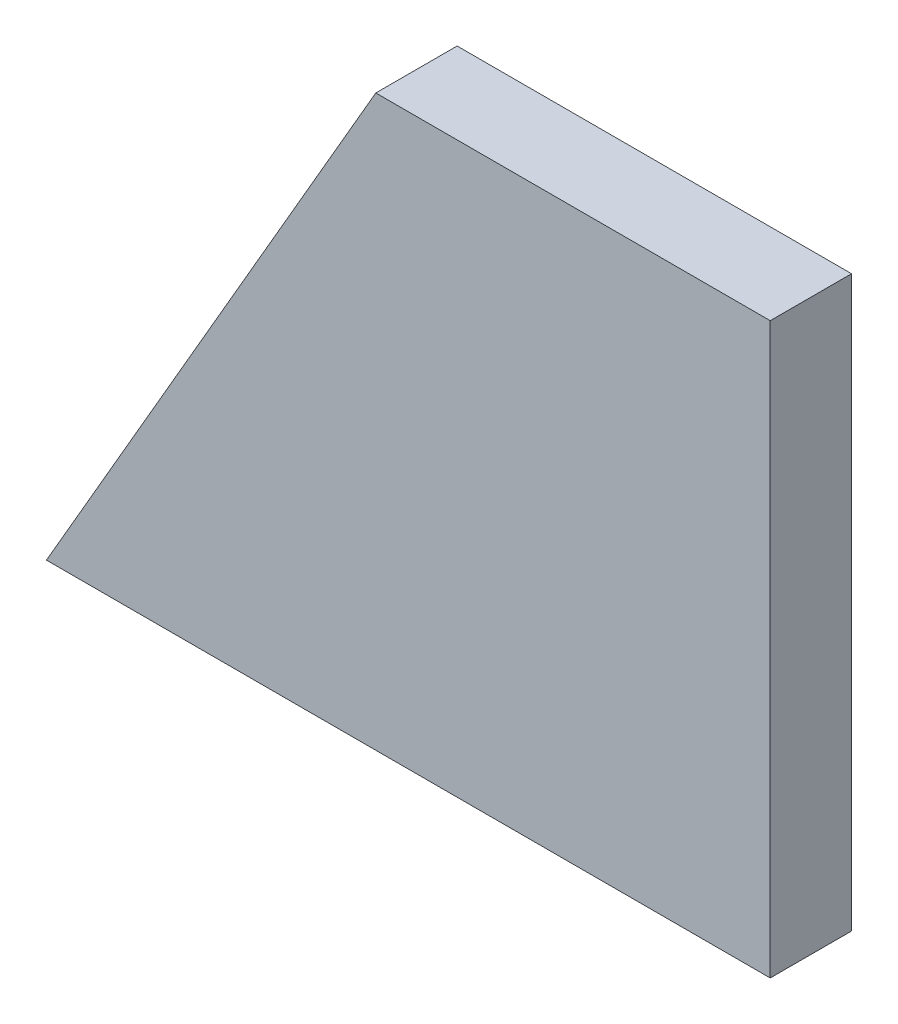
ISO-10303-21;
HEADER;
FILE_DESCRIPTION(('STEP AP214'),'2;1');
FILE_NAME('part.step','',(''),(''),'','','');
FILE_SCHEMA(('AUTOMOTIVE_DESIGN { 1 0 10303 214 1 1 1 1 }'));
ENDSEC;
DATA;
#1=APPLICATION_CONTEXT('core data for automotive mechanical design processes');
#2=APPLICATION_PROTOCOL_DEFINITION('international standard','automotive_design',2000,#1);
#3=PRODUCT_CONTEXT('',#1,'mechanical');
#4=PRODUCT('Part','Part','',(#3));
#5=PRODUCT_RELATED_PRODUCT_CATEGORY('part','',(#4));
#6=PRODUCT_DEFINITION_FORMATION('','',#4);
#7=PRODUCT_DEFINITION_CONTEXT('part definition',#1,'design');
#8=PRODUCT_DEFINITION('design','',#6,#7);
#9=PRODUCT_DEFINITION_SHAPE('','',#8);
#10=(LENGTH_UNIT() NAMED_UNIT(*) SI_UNIT(.MILLI.,.METRE.));
#11=(NAMED_UNIT(*) PLANE_ANGLE_UNIT() SI_UNIT($,.RADIAN.));
#12=(NAMED_UNIT(*) SI_UNIT($,.STERADIAN.) SOLID_ANGLE_UNIT());
#13=UNCERTAINTY_MEASURE_WITH_UNIT(LENGTH_MEASURE(1.E-05),#10,'distance_accuracy_value','');
#14=(GEOMETRIC_REPRESENTATION_CONTEXT(3) GLOBAL_UNCERTAINTY_ASSIGNED_CONTEXT((#13)) GLOBAL_UNIT_ASSIGNED_CONTEXT((#10,
#11,#12)) REPRESENTATION_CONTEXT('',''));
#15=CARTESIAN_POINT('',(0.,0.,0.));
#16=DIRECTION('',(0.,0.,1.));
#17=DIRECTION('',(1.,0.,0.));
#18=AXIS2_PLACEMENT_3D('',#15,#16,#17);
#19=CARTESIAN_POINT('',(0.,0.,10.));
#20=DIRECTION('',(-1.,0.,0.));
#21=DIRECTION('',(0.,0.,1.));
#22=AXIS2_PLACEMENT_3D('',#19,#20,#21);
#23=PLANE('',#22);
#24=DIRECTION('',(0.,1.,0.));
#25=VECTOR('',#24,1.);
#26=CARTESIAN_POINT('',(0.,0.,0.));
#27=LINE('',#26,#25);
#28=CARTESIAN_POINT('',(0.,0.,0.));
#29=VERTEX_POINT('',#28);
#30=CARTESIAN_POINT('',(0.,70.,0.));
#31=VERTEX_POINT('',#30);
#32=EDGE_CURVE('E97',#29,#31,#27,.T.);
#33=ORIENTED_EDGE('',*,*,#32,.T.);
#34=DIRECTION('',(0.,0.,-1.));
#35=VECTOR('',#34,1.);
#36=CARTESIAN_POINT('',(0.,70.,10.));
#37=LINE('',#36,#35);
#38=CARTESIAN_POINT('',(0.,70.,10.));
#39=VERTEX_POINT('',#38);
#40=EDGE_CURVE('E11',#39,#31,#37,.T.);
#41=ORIENTED_EDGE('',*,*,#40,.F.);
#42=DIRECTION('',(0.,1.,0.));
#43=VECTOR('',#42,1.);
#44=CARTESIAN_POINT('',(0.,0.,10.));
#45=LINE('',#44,#43);
#46=CARTESIAN_POINT('',(0.,0.,10.));
#47=VERTEX_POINT('',#46);
#48=EDGE_CURVE('E85',#47,#39,#45,.T.);
#49=ORIENTED_EDGE('',*,*,#48,.F.);
#50=DIRECTION('',(0.,0.,-1.));
#51=VECTOR('',#50,1.);
#52=CARTESIAN_POINT('',(0.,0.,10.));
#53=LINE('',#52,#51);
#54=EDGE_CURVE('E93',#47,#29,#53,.T.);
#55=ORIENTED_EDGE('',*,*,#54,.T.);
#56=EDGE_LOOP('',(#33,#41,#49,#55));
#57=FACE_BOUND('',#56,.T.);
#58=ADVANCED_FACE('F34',(#57),#23,.F.);
#59=CARTESIAN_POINT('',(0.,70.,10.));
#60=DIRECTION('',(0.,-1.,0.));
#61=DIRECTION('',(0.,0.,-1.));
#62=AXIS2_PLACEMENT_3D('',#59,#60,#61);
#63=PLANE('',#62);
#64=DIRECTION('',(-1.,0.,0.));
#65=VECTOR('',#64,1.);
#66=CARTESIAN_POINT('',(0.,70.,0.));
#67=LINE('',#66,#65);
#68=CARTESIAN_POINT('',(-48.5,70.,0.));
#69=VERTEX_POINT('',#68);
#70=EDGE_CURVE('E89',#31,#69,#67,.T.);
#71=ORIENTED_EDGE('',*,*,#70,.T.);
#72=DIRECTION('',(0.,0.,-1.));
#73=VECTOR('',#72,1.);
#74=CARTESIAN_POINT('',(-48.5,70.,10.));
#75=LINE('',#74,#73);
#76=CARTESIAN_POINT('',(-48.5,70.,10.));
#77=VERTEX_POINT('',#76);
#78=EDGE_CURVE('E42',#77,#69,#75,.T.);
#79=ORIENTED_EDGE('',*,*,#78,.F.);
#80=DIRECTION('',(-1.,0.,0.));
#81=VECTOR('',#80,1.);
#82=CARTESIAN_POINT('',(0.,70.,10.));
#83=LINE('',#82,#81);
#84=EDGE_CURVE('E80',#39,#77,#83,.T.);
#85=ORIENTED_EDGE('',*,*,#84,.F.);
#86=ORIENTED_EDGE('',*,*,#40,.T.);
#87=EDGE_LOOP('',(#71,#79,#85,#86));
#88=FACE_BOUND('',#87,.T.);
#89=ADVANCED_FACE('F88',(#88),#63,.F.);
#90=CARTESIAN_POINT('',(-48.5,70.,10.));
#91=DIRECTION('',(0.865567348391287,-0.50079253728353,0.));
#92=DIRECTION('',(0.50079253728353,0.865567348391287,0.));
#93=AXIS2_PLACEMENT_3D('',#90,#91,#92);
#94=PLANE('',#93);
#95=DIRECTION('',(-0.50079253728353,-0.865567348391287,0.));
#96=VECTOR('',#95,1.);
#97=CARTESIAN_POINT('',(-48.5,70.,0.));
#98=LINE('',#97,#96);
#99=CARTESIAN_POINT('',(-89.,0.,0.));
#100=VERTEX_POINT('',#99);
#101=EDGE_CURVE('E67',#69,#100,#98,.T.);
#102=ORIENTED_EDGE('',*,*,#101,.T.);
#103=DIRECTION('',(0.,0.,-1.));
#104=VECTOR('',#103,1.);
#105=CARTESIAN_POINT('',(-89.,0.,10.));
#106=LINE('',#105,#104);
#107=CARTESIAN_POINT('',(-89.,0.,10.));
#108=VERTEX_POINT('',#107);
#109=EDGE_CURVE('E90',#108,#100,#106,.T.);
#110=ORIENTED_EDGE('',*,*,#109,.F.);
#111=DIRECTION('',(-0.50079253728353,-0.865567348391287,0.));
#112=VECTOR('',#111,1.);
#113=CARTESIAN_POINT('',(-48.5,70.,10.));
#114=LINE('',#113,#112);
#115=EDGE_CURVE('E83',#77,#108,#114,.T.);
#116=ORIENTED_EDGE('',*,*,#115,.F.);
#117=ORIENTED_EDGE('',*,*,#78,.T.);
#118=EDGE_LOOP('',(#102,#110,#116,#117));
#119=FACE_BOUND('',#118,.T.);
#120=ADVANCED_FACE('F91',(#119),#94,.F.);
#121=CARTESIAN_POINT('',(0.,0.,10.));
#122=DIRECTION('',(0.,1.,0.));
#123=DIRECTION('',(0.,0.,1.));
#124=AXIS2_PLACEMENT_3D('',#121,#122,#123);
#125=PLANE('',#124);
#126=DIRECTION('',(1.,0.,0.));
#127=VECTOR('',#126,1.);
#128=CARTESIAN_POINT('',(0.,0.,0.));
#129=LINE('',#128,#127);
#130=EDGE_CURVE('E73',#100,#29,#129,.T.);
#131=ORIENTED_EDGE('',*,*,#130,.T.);
#132=ORIENTED_EDGE('',*,*,#54,.F.);
#133=DIRECTION('',(1.,0.,0.));
#134=VECTOR('',#133,1.);
#135=CARTESIAN_POINT('',(0.,0.,10.));
#136=LINE('',#135,#134);
#137=EDGE_CURVE('E50',#108,#47,#136,.T.);
#138=ORIENTED_EDGE('',*,*,#137,.F.);
#139=ORIENTED_EDGE('',*,*,#109,.T.);
#140=EDGE_LOOP('',(#131,#132,#138,#139));
#141=FACE_BOUND('',#140,.T.);
#142=ADVANCED_FACE('F104',(#141),#125,.F.);
#143=CARTESIAN_POINT('',(0.,0.,10.));
#144=DIRECTION('',(0.,0.,1.));
#145=DIRECTION('',(1.,0.,0.));
#146=AXIS2_PLACEMENT_3D('',#143,#144,#145);
#147=PLANE('',#146);
#148=ORIENTED_EDGE('',*,*,#48,.T.);
#149=ORIENTED_EDGE('',*,*,#84,.T.);
#150=ORIENTED_EDGE('',*,*,#115,.T.);
#151=ORIENTED_EDGE('',*,*,#137,.T.);
#152=EDGE_LOOP('',(#148,#149,#150,#151));
#153=FACE_BOUND('',#152,.T.);
#154=ADVANCED_FACE('F81',(#153),#147,.T.);
#155=CARTESIAN_POINT('',(0.,0.,0.));
#156=DIRECTION('',(0.,0.,1.));
#157=DIRECTION('',(1.,0.,0.));
#158=AXIS2_PLACEMENT_3D('',#155,#156,#157);
#159=PLANE('',#158);
#160=ORIENTED_EDGE('',*,*,#32,.F.);
#161=ORIENTED_EDGE('',*,*,#130,.F.);
#162=ORIENTED_EDGE('',*,*,#101,.F.);
#163=ORIENTED_EDGE('',*,*,#70,.F.);
#164=EDGE_LOOP('',(#160,#161,#162,#163));
#165=FACE_BOUND('',#164,.T.);
#166=ADVANCED_FACE('F107',(#165),#159,.F.);
#167=CLOSED_SHELL('',(#58,#89,#120,#142,#154,#166));
#168=MANIFOLD_SOLID_BREP('B2',#167);
#169=ADVANCED_BREP_SHAPE_REPRESENTATION('',(#18,#168),#14);
#170=SHAPE_DEFINITION_REPRESENTATION(#9,#169);
ENDSEC;
END-ISO-10303-21;
